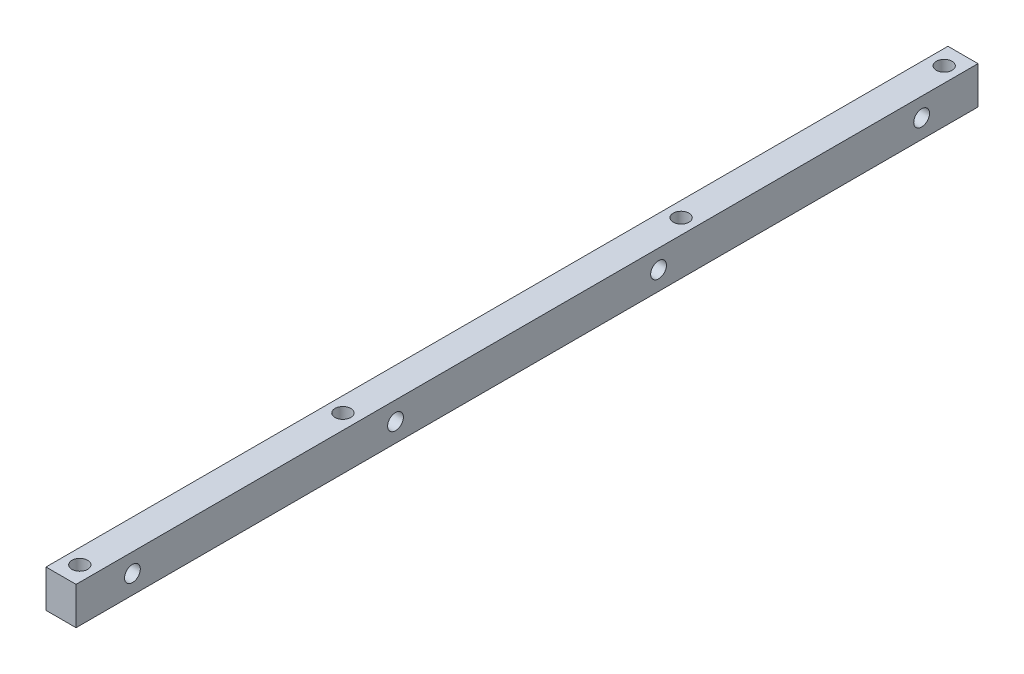
ISO-10303-21;
HEADER;
FILE_DESCRIPTION(('STEP AP214'),'2;1');
FILE_NAME('part.step','',(''),(''),'','','');
FILE_SCHEMA(('AUTOMOTIVE_DESIGN { 1 0 10303 214 1 1 1 1 }'));
ENDSEC;
DATA;
#1=APPLICATION_CONTEXT('core data for automotive mechanical design processes');
#2=APPLICATION_PROTOCOL_DEFINITION('international standard','automotive_design',2000,#1);
#3=PRODUCT_CONTEXT('',#1,'mechanical');
#4=PRODUCT('Part','Part','',(#3));
#5=PRODUCT_RELATED_PRODUCT_CATEGORY('part','',(#4));
#6=PRODUCT_DEFINITION_FORMATION('','',#4);
#7=PRODUCT_DEFINITION_CONTEXT('part definition',#1,'design');
#8=PRODUCT_DEFINITION('design','',#6,#7);
#9=PRODUCT_DEFINITION_SHAPE('','',#8);
#10=(LENGTH_UNIT() NAMED_UNIT(*) SI_UNIT(.MILLI.,.METRE.));
#11=(NAMED_UNIT(*) PLANE_ANGLE_UNIT() SI_UNIT($,.RADIAN.));
#12=(NAMED_UNIT(*) SI_UNIT($,.STERADIAN.) SOLID_ANGLE_UNIT());
#13=UNCERTAINTY_MEASURE_WITH_UNIT(LENGTH_MEASURE(1.E-05),#10,'distance_accuracy_value','');
#14=(GEOMETRIC_REPRESENTATION_CONTEXT(3) GLOBAL_UNCERTAINTY_ASSIGNED_CONTEXT((#13)) GLOBAL_UNIT_ASSIGNED_CONTEXT((#10,
#11,#12)) REPRESENTATION_CONTEXT('',''));
#15=CARTESIAN_POINT('',(0.,0.,0.));
#16=DIRECTION('',(0.,0.,1.));
#17=DIRECTION('',(1.,0.,0.));
#18=AXIS2_PLACEMENT_3D('',#15,#16,#17);
#19=CARTESIAN_POINT('',(4.,-5.,-120.));
#20=DIRECTION('',(0.,-1.,0.));
#21=DIRECTION('',(1.,0.,0.));
#22=AXIS2_PLACEMENT_3D('',#19,#20,#21);
#23=PLANE('',#22);
#24=DIRECTION('',(0.,0.,1.));
#25=VECTOR('',#24,1.);
#26=CARTESIAN_POINT('',(4.,-5.,-120.));
#27=LINE('',#26,#25);
#28=CARTESIAN_POINT('',(4.,-5.,-120.));
#29=VERTEX_POINT('',#28);
#30=CARTESIAN_POINT('',(4.,-5.,120.));
#31=VERTEX_POINT('',#30);
#32=EDGE_CURVE('E83',#29,#31,#27,.T.);
#33=ORIENTED_EDGE('',*,*,#32,.T.);
#34=DIRECTION('',(1.,0.,0.));
#35=VECTOR('',#34,1.);
#36=CARTESIAN_POINT('',(4.,-5.,120.));
#37=LINE('',#36,#35);
#38=CARTESIAN_POINT('',(-4.,-5.,120.));
#39=VERTEX_POINT('',#38);
#40=EDGE_CURVE('E87',#39,#31,#37,.T.);
#41=ORIENTED_EDGE('',*,*,#40,.F.);
#42=DIRECTION('',(0.,0.,1.));
#43=VECTOR('',#42,1.);
#44=CARTESIAN_POINT('',(-4.,-5.,-120.));
#45=LINE('',#44,#43);
#46=CARTESIAN_POINT('',(-4.,-5.,-120.));
#47=VERTEX_POINT('',#46);
#48=EDGE_CURVE('E75',#47,#39,#45,.T.);
#49=ORIENTED_EDGE('',*,*,#48,.F.);
#50=DIRECTION('',(1.,0.,0.));
#51=VECTOR('',#50,1.);
#52=CARTESIAN_POINT('',(4.,-5.,-120.));
#53=LINE('',#52,#51);
#54=EDGE_CURVE('E107',#47,#29,#53,.T.);
#55=ORIENTED_EDGE('',*,*,#54,.T.);
#56=EDGE_LOOP('',(#33,#41,#49,#55));
#57=FACE_BOUND('',#56,.T.);
#58=CARTESIAN_POINT('',(0.,-5.00000000000001,45.));
#59=DIRECTION('',(0.,1.,0.));
#60=DIRECTION('',(0.,0.,1.));
#61=AXIS2_PLACEMENT_3D('',#58,#59,#60);
#62=CIRCLE('',#61,2.1);
#63=CARTESIAN_POINT('',(0.,-5.00000000000001,47.1));
#64=VERTEX_POINT('',#63);
#65=EDGE_CURVE('E97',#64,#64,#62,.T.);
#66=ORIENTED_EDGE('',*,*,#65,.T.);
#67=EDGE_LOOP('',(#66));
#68=FACE_BOUND('',#67,.T.);
#69=CARTESIAN_POINT('',(0.,-5.00000000000001,115.));
#70=DIRECTION('',(0.,1.,0.));
#71=DIRECTION('',(0.,0.,1.));
#72=AXIS2_PLACEMENT_3D('',#69,#70,#71);
#73=CIRCLE('',#72,2.1);
#74=CARTESIAN_POINT('',(0.,-5.00000000000001,117.1));
#75=VERTEX_POINT('',#74);
#76=EDGE_CURVE('E153',#75,#75,#73,.T.);
#77=ORIENTED_EDGE('',*,*,#76,.T.);
#78=EDGE_LOOP('',(#77));
#79=FACE_BOUND('',#78,.T.);
#80=CARTESIAN_POINT('',(0.,-5.00000000000001,-45.));
#81=DIRECTION('',(0.,1.,0.));
#82=DIRECTION('',(0.,0.,1.));
#83=AXIS2_PLACEMENT_3D('',#80,#81,#82);
#84=CIRCLE('',#83,2.1);
#85=CARTESIAN_POINT('',(0.,-5.00000000000001,-42.9));
#86=VERTEX_POINT('',#85);
#87=EDGE_CURVE('E135',#86,#86,#84,.T.);
#88=ORIENTED_EDGE('',*,*,#87,.T.);
#89=EDGE_LOOP('',(#88));
#90=FACE_BOUND('',#89,.T.);
#91=CARTESIAN_POINT('',(0.,-5.00000000000001,-115.));
#92=DIRECTION('',(0.,1.,0.));
#93=DIRECTION('',(0.,0.,1.));
#94=AXIS2_PLACEMENT_3D('',#91,#92,#93);
#95=CIRCLE('',#94,2.1);
#96=CARTESIAN_POINT('',(0.,-5.00000000000001,-112.9));
#97=VERTEX_POINT('',#96);
#98=EDGE_CURVE('E120',#97,#97,#95,.T.);
#99=ORIENTED_EDGE('',*,*,#98,.T.);
#100=EDGE_LOOP('',(#99));
#101=FACE_BOUND('',#100,.T.);
#102=ADVANCED_FACE('F36',(#57,#68,#79,#90,#101),#23,.T.);
#103=CARTESIAN_POINT('',(-4.,-5.,-120.));
#104=DIRECTION('',(-1.,0.,0.));
#105=DIRECTION('',(0.,0.,1.));
#106=AXIS2_PLACEMENT_3D('',#103,#104,#105);
#107=PLANE('',#106);
#108=CARTESIAN_POINT('',(-4.,0.,-105.));
#109=DIRECTION('',(-1.,0.,0.));
#110=DIRECTION('',(0.,0.,1.));
#111=AXIS2_PLACEMENT_3D('',#108,#109,#110);
#112=CIRCLE('',#111,2.1);
#113=CARTESIAN_POINT('',(-4.,0.,-102.9));
#114=VERTEX_POINT('',#113);
#115=EDGE_CURVE('E127',#114,#114,#112,.T.);
#116=ORIENTED_EDGE('',*,*,#115,.F.);
#117=EDGE_LOOP('',(#116));
#118=FACE_BOUND('',#117,.T.);
#119=CARTESIAN_POINT('',(-4.,0.,-35.));
#120=DIRECTION('',(-1.,0.,0.));
#121=DIRECTION('',(0.,0.,1.));
#122=AXIS2_PLACEMENT_3D('',#119,#120,#121);
#123=CIRCLE('',#122,2.1);
#124=CARTESIAN_POINT('',(-4.,0.,-32.9));
#125=VERTEX_POINT('',#124);
#126=EDGE_CURVE('E116',#125,#125,#123,.T.);
#127=ORIENTED_EDGE('',*,*,#126,.F.);
#128=EDGE_LOOP('',(#127));
#129=FACE_BOUND('',#128,.T.);
#130=CARTESIAN_POINT('',(-4.,0.,105.));
#131=DIRECTION('',(-1.,0.,0.));
#132=DIRECTION('',(0.,0.,1.));
#133=AXIS2_PLACEMENT_3D('',#130,#131,#132);
#134=CIRCLE('',#133,2.1);
#135=CARTESIAN_POINT('',(-4.,0.,107.1));
#136=VERTEX_POINT('',#135);
#137=EDGE_CURVE('E138',#136,#136,#134,.T.);
#138=ORIENTED_EDGE('',*,*,#137,.F.);
#139=EDGE_LOOP('',(#138));
#140=FACE_BOUND('',#139,.T.);
#141=CARTESIAN_POINT('',(-4.,0.,35.));
#142=DIRECTION('',(-1.,0.,0.));
#143=DIRECTION('',(0.,0.,1.));
#144=AXIS2_PLACEMENT_3D('',#141,#142,#143);
#145=CIRCLE('',#144,2.1);
#146=CARTESIAN_POINT('',(-4.,0.,37.1));
#147=VERTEX_POINT('',#146);
#148=EDGE_CURVE('E144',#147,#147,#145,.T.);
#149=ORIENTED_EDGE('',*,*,#148,.F.);
#150=EDGE_LOOP('',(#149));
#151=FACE_BOUND('',#150,.T.);
#152=ORIENTED_EDGE('',*,*,#48,.T.);
#153=DIRECTION('',(0.,-1.,0.));
#154=VECTOR('',#153,1.);
#155=CARTESIAN_POINT('',(-4.,-5.,120.));
#156=LINE('',#155,#154);
#157=CARTESIAN_POINT('',(-4.,5.,120.));
#158=VERTEX_POINT('',#157);
#159=EDGE_CURVE('E78',#158,#39,#156,.T.);
#160=ORIENTED_EDGE('',*,*,#159,.F.);
#161=DIRECTION('',(0.,0.,1.));
#162=VECTOR('',#161,1.);
#163=CARTESIAN_POINT('',(-4.,5.,-120.));
#164=LINE('',#163,#162);
#165=CARTESIAN_POINT('',(-4.,5.,-120.));
#166=VERTEX_POINT('',#165);
#167=EDGE_CURVE('E11',#166,#158,#164,.T.);
#168=ORIENTED_EDGE('',*,*,#167,.F.);
#169=DIRECTION('',(0.,-1.,0.));
#170=VECTOR('',#169,1.);
#171=CARTESIAN_POINT('',(-4.,-5.,-120.));
#172=LINE('',#171,#170);
#173=EDGE_CURVE('E79',#166,#47,#172,.T.);
#174=ORIENTED_EDGE('',*,*,#173,.T.);
#175=EDGE_LOOP('',(#152,#160,#168,#174));
#176=FACE_BOUND('',#175,.T.);
#177=ADVANCED_FACE('F38',(#118,#129,#140,#151,#176),#107,.T.);
#178=CARTESIAN_POINT('',(-4.,5.,-120.));
#179=DIRECTION('',(0.,1.,0.));
#180=DIRECTION('',(-1.,0.,0.));
#181=AXIS2_PLACEMENT_3D('',#178,#179,#180);
#182=PLANE('',#181);
#183=CARTESIAN_POINT('',(0.,5.,-115.));
#184=DIRECTION('',(0.,1.,0.));
#185=DIRECTION('',(0.,0.,1.));
#186=AXIS2_PLACEMENT_3D('',#183,#184,#185);
#187=CIRCLE('',#186,2.09999999999999);
#188=CARTESIAN_POINT('',(0.,5.,-112.9));
#189=VERTEX_POINT('',#188);
#190=EDGE_CURVE('E115',#189,#189,#187,.T.);
#191=ORIENTED_EDGE('',*,*,#190,.F.);
#192=EDGE_LOOP('',(#191));
#193=FACE_BOUND('',#192,.T.);
#194=CARTESIAN_POINT('',(0.,5.,-45.));
#195=DIRECTION('',(0.,1.,0.));
#196=DIRECTION('',(0.,0.,1.));
#197=AXIS2_PLACEMENT_3D('',#194,#195,#196);
#198=CIRCLE('',#197,2.09999999999999);
#199=CARTESIAN_POINT('',(0.,5.,-42.9));
#200=VERTEX_POINT('',#199);
#201=EDGE_CURVE('E132',#200,#200,#198,.T.);
#202=ORIENTED_EDGE('',*,*,#201,.F.);
#203=EDGE_LOOP('',(#202));
#204=FACE_BOUND('',#203,.T.);
#205=CARTESIAN_POINT('',(0.,5.,115.));
#206=DIRECTION('',(0.,1.,0.));
#207=DIRECTION('',(0.,0.,1.));
#208=AXIS2_PLACEMENT_3D('',#205,#206,#207);
#209=CIRCLE('',#208,2.09999999999999);
#210=CARTESIAN_POINT('',(0.,5.,117.1));
#211=VERTEX_POINT('',#210);
#212=EDGE_CURVE('E150',#211,#211,#209,.T.);
#213=ORIENTED_EDGE('',*,*,#212,.F.);
#214=EDGE_LOOP('',(#213));
#215=FACE_BOUND('',#214,.T.);
#216=CARTESIAN_POINT('',(0.,5.,45.));
#217=DIRECTION('',(0.,1.,0.));
#218=DIRECTION('',(0.,0.,1.));
#219=AXIS2_PLACEMENT_3D('',#216,#217,#218);
#220=CIRCLE('',#219,2.09999999999999);
#221=CARTESIAN_POINT('',(0.,5.,47.1));
#222=VERTEX_POINT('',#221);
#223=EDGE_CURVE('E100',#222,#222,#220,.T.);
#224=ORIENTED_EDGE('',*,*,#223,.F.);
#225=EDGE_LOOP('',(#224));
#226=FACE_BOUND('',#225,.T.);
#227=ORIENTED_EDGE('',*,*,#167,.T.);
#228=DIRECTION('',(-1.,0.,0.));
#229=VECTOR('',#228,1.);
#230=CARTESIAN_POINT('',(-4.,5.,120.));
#231=LINE('',#230,#229);
#232=CARTESIAN_POINT('',(4.,5.,120.));
#233=VERTEX_POINT('',#232);
#234=EDGE_CURVE('E96',#233,#158,#231,.T.);
#235=ORIENTED_EDGE('',*,*,#234,.F.);
#236=DIRECTION('',(0.,0.,1.));
#237=VECTOR('',#236,1.);
#238=CARTESIAN_POINT('',(4.,5.,-120.));
#239=LINE('',#238,#237);
#240=CARTESIAN_POINT('',(4.,5.,-120.));
#241=VERTEX_POINT('',#240);
#242=EDGE_CURVE('E45',#241,#233,#239,.T.);
#243=ORIENTED_EDGE('',*,*,#242,.F.);
#244=DIRECTION('',(-1.,0.,0.));
#245=VECTOR('',#244,1.);
#246=CARTESIAN_POINT('',(-4.,5.,-120.));
#247=LINE('',#246,#245);
#248=EDGE_CURVE('E84',#241,#166,#247,.T.);
#249=ORIENTED_EDGE('',*,*,#248,.T.);
#250=EDGE_LOOP('',(#227,#235,#243,#249));
#251=FACE_BOUND('',#250,.T.);
#252=ADVANCED_FACE('F160',(#193,#204,#215,#226,#251),#182,.T.);
#253=CARTESIAN_POINT('',(4.,5.,-120.));
#254=DIRECTION('',(1.,0.,0.));
#255=DIRECTION('',(0.,0.,-1.));
#256=AXIS2_PLACEMENT_3D('',#253,#254,#255);
#257=PLANE('',#256);
#258=CARTESIAN_POINT('',(4.,0.,-105.));
#259=DIRECTION('',(1.,0.,0.));
#260=DIRECTION('',(0.,0.,-1.));
#261=AXIS2_PLACEMENT_3D('',#258,#259,#260);
#262=CIRCLE('',#261,2.1);
#263=CARTESIAN_POINT('',(4.,0.,-107.1));
#264=VERTEX_POINT('',#263);
#265=EDGE_CURVE('E40',#264,#264,#262,.T.);
#266=ORIENTED_EDGE('',*,*,#265,.F.);
#267=EDGE_LOOP('',(#266));
#268=FACE_BOUND('',#267,.T.);
#269=CARTESIAN_POINT('',(4.,0.,-35.));
#270=DIRECTION('',(1.,0.,0.));
#271=DIRECTION('',(0.,0.,-1.));
#272=AXIS2_PLACEMENT_3D('',#269,#270,#271);
#273=CIRCLE('',#272,2.1);
#274=CARTESIAN_POINT('',(4.,0.,-37.1));
#275=VERTEX_POINT('',#274);
#276=EDGE_CURVE('E113',#275,#275,#273,.T.);
#277=ORIENTED_EDGE('',*,*,#276,.F.);
#278=EDGE_LOOP('',(#277));
#279=FACE_BOUND('',#278,.T.);
#280=CARTESIAN_POINT('',(4.,0.,105.));
#281=DIRECTION('',(1.,0.,0.));
#282=DIRECTION('',(0.,0.,-1.));
#283=AXIS2_PLACEMENT_3D('',#280,#281,#282);
#284=CIRCLE('',#283,2.1);
#285=CARTESIAN_POINT('',(4.,0.,102.9));
#286=VERTEX_POINT('',#285);
#287=EDGE_CURVE('E141',#286,#286,#284,.T.);
#288=ORIENTED_EDGE('',*,*,#287,.F.);
#289=EDGE_LOOP('',(#288));
#290=FACE_BOUND('',#289,.T.);
#291=CARTESIAN_POINT('',(4.,0.,35.));
#292=DIRECTION('',(1.,0.,0.));
#293=DIRECTION('',(0.,0.,-1.));
#294=AXIS2_PLACEMENT_3D('',#291,#292,#293);
#295=CIRCLE('',#294,2.1);
#296=CARTESIAN_POINT('',(4.,0.,32.9));
#297=VERTEX_POINT('',#296);
#298=EDGE_CURVE('E147',#297,#297,#295,.T.);
#299=ORIENTED_EDGE('',*,*,#298,.F.);
#300=EDGE_LOOP('',(#299));
#301=FACE_BOUND('',#300,.T.);
#302=ORIENTED_EDGE('',*,*,#242,.T.);
#303=DIRECTION('',(0.,1.,0.));
#304=VECTOR('',#303,1.);
#305=CARTESIAN_POINT('',(4.,5.,120.));
#306=LINE('',#305,#304);
#307=EDGE_CURVE('E92',#31,#233,#306,.T.);
#308=ORIENTED_EDGE('',*,*,#307,.F.);
#309=ORIENTED_EDGE('',*,*,#32,.F.);
#310=DIRECTION('',(0.,1.,0.));
#311=VECTOR('',#310,1.);
#312=CARTESIAN_POINT('',(4.,5.,-120.));
#313=LINE('',#312,#311);
#314=EDGE_CURVE('E109',#29,#241,#313,.T.);
#315=ORIENTED_EDGE('',*,*,#314,.T.);
#316=EDGE_LOOP('',(#302,#308,#309,#315));
#317=FACE_BOUND('',#316,.T.);
#318=ADVANCED_FACE('F162',(#268,#279,#290,#301,#317),#257,.T.);
#319=CARTESIAN_POINT('',(0.,0.,-120.));
#320=DIRECTION('',(0.,0.,-1.));
#321=DIRECTION('',(-1.,0.,0.));
#322=AXIS2_PLACEMENT_3D('',#319,#320,#321);
#323=PLANE('',#322);
#324=ORIENTED_EDGE('',*,*,#173,.F.);
#325=ORIENTED_EDGE('',*,*,#248,.F.);
#326=ORIENTED_EDGE('',*,*,#314,.F.);
#327=ORIENTED_EDGE('',*,*,#54,.F.);
#328=EDGE_LOOP('',(#324,#325,#326,#327));
#329=FACE_BOUND('',#328,.T.);
#330=ADVANCED_FACE('F168',(#329),#323,.T.);
#331=CARTESIAN_POINT('',(0.,0.,120.));
#332=DIRECTION('',(0.,0.,-1.));
#333=DIRECTION('',(-1.,0.,0.));
#334=AXIS2_PLACEMENT_3D('',#331,#332,#333);
#335=PLANE('',#334);
#336=ORIENTED_EDGE('',*,*,#159,.T.);
#337=ORIENTED_EDGE('',*,*,#40,.T.);
#338=ORIENTED_EDGE('',*,*,#307,.T.);
#339=ORIENTED_EDGE('',*,*,#234,.T.);
#340=EDGE_LOOP('',(#336,#337,#338,#339));
#341=FACE_BOUND('',#340,.T.);
#342=ADVANCED_FACE('F95',(#341),#335,.F.);
#343=CARTESIAN_POINT('',(0.,5.,45.));
#344=DIRECTION('',(0.,1.,0.));
#345=DIRECTION('',(0.,0.,1.));
#346=AXIS2_PLACEMENT_3D('',#343,#344,#345);
#347=CYLINDRICAL_SURFACE('',#346,2.09999999999999);
#348=ORIENTED_EDGE('',*,*,#65,.F.);
#349=EDGE_LOOP('',(#348));
#350=FACE_BOUND('',#349,.T.);
#351=ORIENTED_EDGE('',*,*,#223,.T.);
#352=EDGE_LOOP('',(#351));
#353=FACE_BOUND('',#352,.T.);
#354=ADVANCED_FACE('F158',(#350,#353),#347,.F.);
#355=CARTESIAN_POINT('',(0.,5.,115.));
#356=DIRECTION('',(0.,1.,0.));
#357=DIRECTION('',(0.,0.,1.));
#358=AXIS2_PLACEMENT_3D('',#355,#356,#357);
#359=CYLINDRICAL_SURFACE('',#358,2.09999999999999);
#360=ORIENTED_EDGE('',*,*,#76,.F.);
#361=EDGE_LOOP('',(#360));
#362=FACE_BOUND('',#361,.T.);
#363=ORIENTED_EDGE('',*,*,#212,.T.);
#364=EDGE_LOOP('',(#363));
#365=FACE_BOUND('',#364,.T.);
#366=ADVANCED_FACE('F197',(#362,#365),#359,.F.);
#367=CARTESIAN_POINT('',(-4.,0.,35.));
#368=DIRECTION('',(-1.,0.,0.));
#369=DIRECTION('',(0.,0.,1.));
#370=AXIS2_PLACEMENT_3D('',#367,#368,#369);
#371=CYLINDRICAL_SURFACE('',#370,2.1);
#372=ORIENTED_EDGE('',*,*,#298,.T.);
#373=EDGE_LOOP('',(#372));
#374=FACE_BOUND('',#373,.T.);
#375=ORIENTED_EDGE('',*,*,#148,.T.);
#376=EDGE_LOOP('',(#375));
#377=FACE_BOUND('',#376,.T.);
#378=ADVANCED_FACE('F194',(#374,#377),#371,.F.);
#379=CARTESIAN_POINT('',(-4.,0.,105.));
#380=DIRECTION('',(-1.,0.,0.));
#381=DIRECTION('',(0.,0.,1.));
#382=AXIS2_PLACEMENT_3D('',#379,#380,#381);
#383=CYLINDRICAL_SURFACE('',#382,2.1);
#384=ORIENTED_EDGE('',*,*,#287,.T.);
#385=EDGE_LOOP('',(#384));
#386=FACE_BOUND('',#385,.T.);
#387=ORIENTED_EDGE('',*,*,#137,.T.);
#388=EDGE_LOOP('',(#387));
#389=FACE_BOUND('',#388,.T.);
#390=ADVANCED_FACE('F196',(#386,#389),#383,.F.);
#391=CARTESIAN_POINT('',(0.,5.,-45.));
#392=DIRECTION('',(0.,1.,0.));
#393=DIRECTION('',(0.,0.,1.));
#394=AXIS2_PLACEMENT_3D('',#391,#392,#393);
#395=CYLINDRICAL_SURFACE('',#394,2.09999999999999);
#396=ORIENTED_EDGE('',*,*,#87,.F.);
#397=EDGE_LOOP('',(#396));
#398=FACE_BOUND('',#397,.T.);
#399=ORIENTED_EDGE('',*,*,#201,.T.);
#400=EDGE_LOOP('',(#399));
#401=FACE_BOUND('',#400,.T.);
#402=ADVANCED_FACE('F204',(#398,#401),#395,.F.);
#403=CARTESIAN_POINT('',(0.,5.,-115.));
#404=DIRECTION('',(0.,1.,0.));
#405=DIRECTION('',(0.,0.,1.));
#406=AXIS2_PLACEMENT_3D('',#403,#404,#405);
#407=CYLINDRICAL_SURFACE('',#406,2.09999999999999);
#408=ORIENTED_EDGE('',*,*,#98,.F.);
#409=EDGE_LOOP('',(#408));
#410=FACE_BOUND('',#409,.T.);
#411=ORIENTED_EDGE('',*,*,#190,.T.);
#412=EDGE_LOOP('',(#411));
#413=FACE_BOUND('',#412,.T.);
#414=ADVANCED_FACE('F271',(#410,#413),#407,.F.);
#415=CARTESIAN_POINT('',(-4.,0.,-35.));
#416=DIRECTION('',(-1.,0.,0.));
#417=DIRECTION('',(0.,0.,1.));
#418=AXIS2_PLACEMENT_3D('',#415,#416,#417);
#419=CYLINDRICAL_SURFACE('',#418,2.1);
#420=ORIENTED_EDGE('',*,*,#276,.T.);
#421=EDGE_LOOP('',(#420));
#422=FACE_BOUND('',#421,.T.);
#423=ORIENTED_EDGE('',*,*,#126,.T.);
#424=EDGE_LOOP('',(#423));
#425=FACE_BOUND('',#424,.T.);
#426=ADVANCED_FACE('F280',(#422,#425),#419,.F.);
#427=CARTESIAN_POINT('',(-4.,0.,-105.));
#428=DIRECTION('',(-1.,0.,0.));
#429=DIRECTION('',(0.,0.,1.));
#430=AXIS2_PLACEMENT_3D('',#427,#428,#429);
#431=CYLINDRICAL_SURFACE('',#430,2.1);
#432=ORIENTED_EDGE('',*,*,#265,.T.);
#433=EDGE_LOOP('',(#432));
#434=FACE_BOUND('',#433,.T.);
#435=ORIENTED_EDGE('',*,*,#115,.T.);
#436=EDGE_LOOP('',(#435));
#437=FACE_BOUND('',#436,.T.);
#438=ADVANCED_FACE('F290',(#434,#437),#431,.F.);
#439=CLOSED_SHELL('',(#102,#177,#252,#318,#330,#342,#354,#366,#378,#390,#402,#414,#426,#438));
#440=MANIFOLD_SOLID_BREP('B2',#439);
#441=ADVANCED_BREP_SHAPE_REPRESENTATION('',(#18,#440),#14);
#442=SHAPE_DEFINITION_REPRESENTATION(#9,#441);
ENDSEC;
END-ISO-10303-21;
